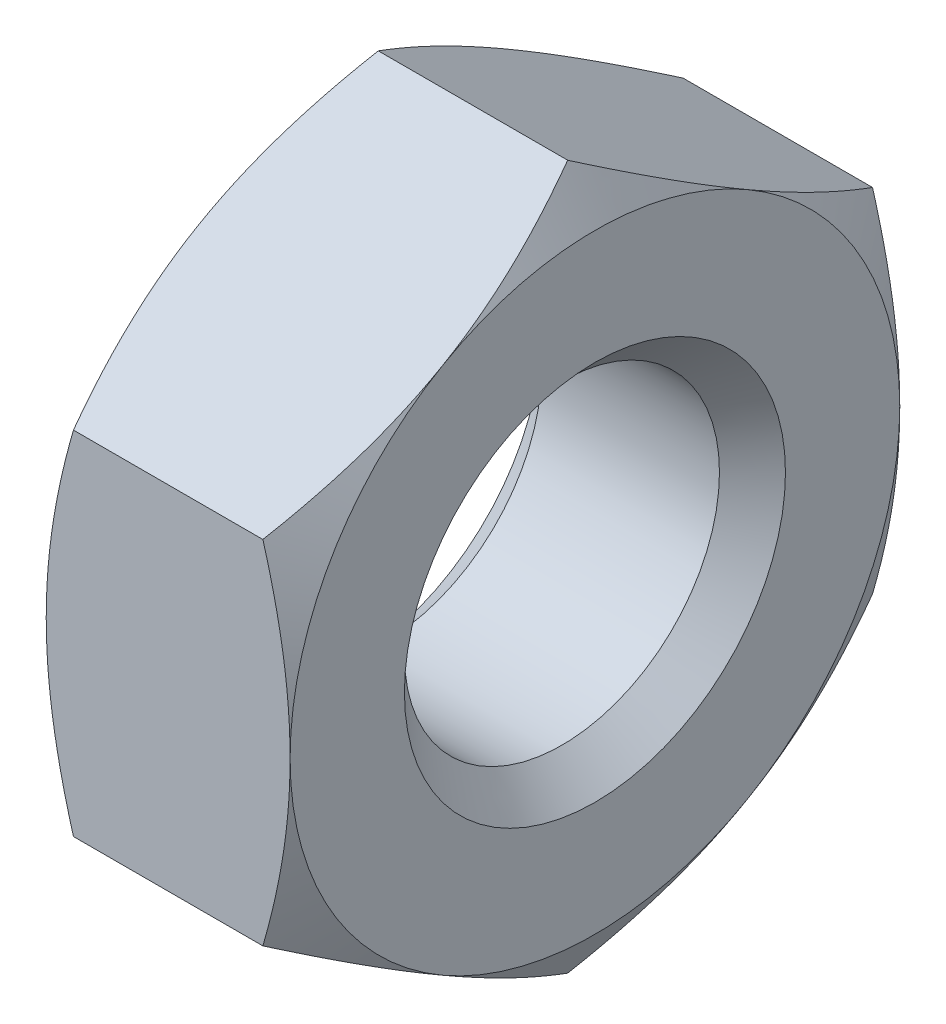
ISO-10303-21;
HEADER;
FILE_DESCRIPTION(('STEP AP214'),'2;1');
FILE_NAME('part.step','',(''),(''),'','','');
FILE_SCHEMA(('AUTOMOTIVE_DESIGN { 1 0 10303 214 1 1 1 1 }'));
ENDSEC;
DATA;
#1=APPLICATION_CONTEXT('core data for automotive mechanical design processes');
#2=APPLICATION_PROTOCOL_DEFINITION('international standard','automotive_design',2000,#1);
#3=PRODUCT_CONTEXT('',#1,'mechanical');
#4=PRODUCT('Part','Part','',(#3));
#5=PRODUCT_RELATED_PRODUCT_CATEGORY('part','',(#4));
#6=PRODUCT_DEFINITION_FORMATION('','',#4);
#7=PRODUCT_DEFINITION_CONTEXT('part definition',#1,'design');
#8=PRODUCT_DEFINITION('design','',#6,#7);
#9=PRODUCT_DEFINITION_SHAPE('','',#8);
#10=(LENGTH_UNIT() NAMED_UNIT(*) SI_UNIT(.MILLI.,.METRE.));
#11=(NAMED_UNIT(*) PLANE_ANGLE_UNIT() SI_UNIT($,.RADIAN.));
#12=(NAMED_UNIT(*) SI_UNIT($,.STERADIAN.) SOLID_ANGLE_UNIT());
#13=UNCERTAINTY_MEASURE_WITH_UNIT(LENGTH_MEASURE(1.E-05),#10,'distance_accuracy_value','');
#14=(GEOMETRIC_REPRESENTATION_CONTEXT(3) GLOBAL_UNCERTAINTY_ASSIGNED_CONTEXT((#13)) GLOBAL_UNIT_ASSIGNED_CONTEXT((#10,
#11,#12)) REPRESENTATION_CONTEXT('',''));
#15=CARTESIAN_POINT('',(0.,0.,0.));
#16=DIRECTION('',(0.,0.,1.));
#17=DIRECTION('',(1.,0.,0.));
#18=AXIS2_PLACEMENT_3D('',#15,#16,#17);
#19=CARTESIAN_POINT('',(-1.6,0.,0.));
#20=DIRECTION('',(1.,0.,0.));
#21=DIRECTION('',(0.,0.,-1.));
#22=AXIS2_PLACEMENT_3D('',#19,#20,#21);
#23=PLANE('',#22);
#24=CARTESIAN_POINT('',(-1.6,0.,0.));
#25=DIRECTION('',(-1.,0.,0.));
#26=DIRECTION('',(0.,0.,1.));
#27=AXIS2_PLACEMENT_3D('',#24,#25,#26);
#28=CIRCLE('',#27,4.);
#29=CARTESIAN_POINT('',(-1.6,0.,4.));
#30=VERTEX_POINT('',#29);
#31=CARTESIAN_POINT('',(-1.6,3.46410161513776,2.));
#32=VERTEX_POINT('',#31);
#33=EDGE_CURVE('E11',#30,#32,#28,.T.);
#34=ORIENTED_EDGE('',*,*,#33,.T.);
#35=CARTESIAN_POINT('',(-1.6,3.46410161513775,-2.));
#36=VERTEX_POINT('',#35);
#37=EDGE_CURVE('E43',#32,#36,#28,.T.);
#38=ORIENTED_EDGE('',*,*,#37,.T.);
#39=CARTESIAN_POINT('',(-1.6,0.,-4.));
#40=VERTEX_POINT('',#39);
#41=EDGE_CURVE('E339',#36,#40,#28,.T.);
#42=ORIENTED_EDGE('',*,*,#41,.T.);
#43=CARTESIAN_POINT('',(-1.6,-3.46410161513776,-2.));
#44=VERTEX_POINT('',#43);
#45=EDGE_CURVE('E337',#40,#44,#28,.T.);
#46=ORIENTED_EDGE('',*,*,#45,.T.);
#47=CARTESIAN_POINT('',(-1.6,-3.46410161513775,2.));
#48=VERTEX_POINT('',#47);
#49=EDGE_CURVE('E332',#44,#48,#28,.T.);
#50=ORIENTED_EDGE('',*,*,#49,.T.);
#51=EDGE_CURVE('E44',#48,#30,#28,.T.);
#52=ORIENTED_EDGE('',*,*,#51,.T.);
#53=EDGE_LOOP('',(#34,#38,#42,#46,#50,#52));
#54=FACE_BOUND('',#53,.T.);
#55=CARTESIAN_POINT('',(-1.6,0.,0.));
#56=DIRECTION('',(-1.,0.,0.));
#57=DIRECTION('',(0.,0.,1.));
#58=AXIS2_PLACEMENT_3D('',#55,#56,#57);
#59=CIRCLE('',#58,2.5);
#60=CARTESIAN_POINT('',(-1.6,0.,2.5));
#61=VERTEX_POINT('',#60);
#62=EDGE_CURVE('E141',#61,#61,#59,.T.);
#63=ORIENTED_EDGE('',*,*,#62,.F.);
#64=EDGE_LOOP('',(#63));
#65=FACE_BOUND('',#64,.T.);
#66=ADVANCED_FACE('F36',(#54,#65),#23,.F.);
#67=CARTESIAN_POINT('',(1.6,4.,0.));
#68=DIRECTION('',(-1.,0.,0.));
#69=DIRECTION('',(0.,0.,1.));
#70=AXIS2_PLACEMENT_3D('',#67,#68,#69);
#71=PLANE('',#70);
#72=CARTESIAN_POINT('',(1.6,0.,0.));
#73=DIRECTION('',(-1.,0.,0.));
#74=DIRECTION('',(0.,0.,1.));
#75=AXIS2_PLACEMENT_3D('',#72,#73,#74);
#76=CIRCLE('',#75,4.);
#77=CARTESIAN_POINT('',(1.6,0.,4.));
#78=VERTEX_POINT('',#77);
#79=CARTESIAN_POINT('',(1.6,3.46410161513776,2.));
#80=VERTEX_POINT('',#79);
#81=EDGE_CURVE('E288',#78,#80,#76,.T.);
#82=ORIENTED_EDGE('',*,*,#81,.F.);
#83=CARTESIAN_POINT('',(1.6,-3.46410161513776,2.));
#84=VERTEX_POINT('',#83);
#85=EDGE_CURVE('E278',#84,#78,#76,.T.);
#86=ORIENTED_EDGE('',*,*,#85,.F.);
#87=CARTESIAN_POINT('',(1.6,-3.46410161513776,-2.));
#88=VERTEX_POINT('',#87);
#89=EDGE_CURVE('E284',#88,#84,#76,.T.);
#90=ORIENTED_EDGE('',*,*,#89,.F.);
#91=CARTESIAN_POINT('',(1.6,0.,-4.));
#92=VERTEX_POINT('',#91);
#93=EDGE_CURVE('E290',#92,#88,#76,.T.);
#94=ORIENTED_EDGE('',*,*,#93,.F.);
#95=CARTESIAN_POINT('',(1.6,3.46410161513775,-2.));
#96=VERTEX_POINT('',#95);
#97=EDGE_CURVE('E291',#96,#92,#76,.T.);
#98=ORIENTED_EDGE('',*,*,#97,.F.);
#99=EDGE_CURVE('E292',#80,#96,#76,.T.);
#100=ORIENTED_EDGE('',*,*,#99,.F.);
#101=EDGE_LOOP('',(#82,#86,#90,#94,#98,#100));
#102=FACE_BOUND('',#101,.T.);
#103=CARTESIAN_POINT('',(1.6,0.,0.));
#104=DIRECTION('',(-1.,0.,0.));
#105=DIRECTION('',(0.,0.,1.));
#106=AXIS2_PLACEMENT_3D('',#103,#104,#105);
#107=CIRCLE('',#106,2.5);
#108=CARTESIAN_POINT('',(1.6,0.,2.5));
#109=VERTEX_POINT('',#108);
#110=EDGE_CURVE('E620',#109,#109,#107,.T.);
#111=ORIENTED_EDGE('',*,*,#110,.T.);
#112=EDGE_LOOP('',(#111));
#113=FACE_BOUND('',#112,.T.);
#114=ADVANCED_FACE('F172',(#102,#113),#71,.F.);
#115=CARTESIAN_POINT('',(-1.1381197846483,0.,0.));
#116=DIRECTION('',(1.,0.,0.));
#117=DIRECTION('',(0.,0.,-1.));
#118=AXIS2_PLACEMENT_3D('',#115,#116,#117);
#119=CONICAL_SURFACE('',#118,4.8,1.0471975511966);
#120=CARTESIAN_POINT('',(0.321129241439828,-6.13939413294062,-4.));
#121=CARTESIAN_POINT('',(0.236895438647627,-5.96521405575991,-4.));
#122=CARTESIAN_POINT('',(0.153488032778512,-5.79062719131365,-4.));
#123=CARTESIAN_POINT('',(-0.0112078629676559,-5.4404233088383,-4.));
#124=CARTESIAN_POINT('',(-0.092496005662846,-5.26480612772211,-4.));
#125=CARTESIAN_POINT('',(-0.252910016479831,-4.91138909620253,-4.));
#126=CARTESIAN_POINT('',(-0.332021126482258,-4.73358252336361,-4.));
#127=CARTESIAN_POINT('',(-0.486919193384971,-4.37653257309947,-4.));
#128=CARTESIAN_POINT('',(-0.562706311846289,-4.19728926600801,-4.));
#129=CARTESIAN_POINT('',(-0.712340691228334,-3.83154690304012,-4.));
#130=CARTESIAN_POINT('',(-0.786057043950778,-3.64499398861433,-4.));
#131=CARTESIAN_POINT('',(-0.927754117835969,-3.26968207246464,-4.));
#132=CARTESIAN_POINT('',(-0.995734186447363,-3.08092282252454,-4.));
#133=CARTESIAN_POINT('',(-1.12412704969832,-2.70127250879012,-4.));
#134=CARTESIAN_POINT('',(-1.18455573470301,-2.51038687463865,-4.));
#135=CARTESIAN_POINT('',(-1.29586469424675,-2.12587868357917,-4.));
#136=CARTESIAN_POINT('',(-1.34674804503767,-1.9322570301368,-4.));
#137=CARTESIAN_POINT('',(-1.43621571413744,-1.54322946382705,-4.));
#138=CARTESIAN_POINT('',(-1.47486428853927,-1.34783861004955,-4.));
#139=CARTESIAN_POINT('',(-1.53763422340833,-0.954695670395885,-4.));
#140=CARTESIAN_POINT('',(-1.56175683200502,-0.756943788878231,-4.));
#141=CARTESIAN_POINT('',(-1.59323359916261,-0.362621629692277,-4.));
#142=CARTESIAN_POINT('',(-1.60079822453623,-0.166068575033682,-4.));
#143=CARTESIAN_POINT('',(-1.59906790973023,0.226977102826042,-4.));
#144=CARTESIAN_POINT('',(-1.58977250832793,0.423469724226888,-4.));
#145=CARTESIAN_POINT('',(-1.5601531531514,0.758990273736848,-4.));
#146=CARTESIAN_POINT('',(-1.5437429725596,0.89838321105386,-4.));
#147=CARTESIAN_POINT('',(-1.50349476320339,1.176100092079,-4.));
#148=CARTESIAN_POINT('',(-1.47965566898105,1.31442387953113,-4.));
#149=CARTESIAN_POINT('',(-1.39825326079294,1.72763495504875,-4.));
#150=CARTESIAN_POINT('',(-1.33082125051095,2.00059716271885,-4.));
#151=CARTESIAN_POINT('',(-1.21451374843233,2.40866187771308,-4.));
#152=CARTESIAN_POINT('',(-1.17269287237421,2.54589494973042,-4.));
#153=CARTESIAN_POINT('',(-1.08486276665558,2.8190270799784,-4.));
#154=CARTESIAN_POINT('',(-1.03885351028714,2.95492612969629,-4.));
#155=CARTESIAN_POINT('',(-0.943372017914805,3.22543632873519,-4.));
#156=CARTESIAN_POINT('',(-0.893901026218928,3.36004792125235,-4.));
#157=CARTESIAN_POINT('',(-0.792062237734925,3.62816633823095,-4.));
#158=CARTESIAN_POINT('',(-0.739694467723296,3.76167317289116,-4.));
#159=CARTESIAN_POINT('',(-0.61762334906242,4.06475987665192,-4.));
#160=CARTESIAN_POINT('',(-0.547153932986005,4.23403057744385,-4.));
#161=CARTESIAN_POINT('',(-0.403059118637126,4.57122630399104,-4.));
#162=CARTESIAN_POINT('',(-0.329433568097402,4.73915126435628,-4.));
#163=CARTESIAN_POINT('',(-0.104752882922826,5.24128493973558,-4.));
#164=CARTESIAN_POINT('',(0.0500845152016255,5.57379958004733,-4.));
#165=CARTESIAN_POINT('',(0.366582884054273,6.23589456855969,-4.));
#166=CARTESIAN_POINT('',(0.528249781173928,6.56547205474271,-4.));
#167=CARTESIAN_POINT('',(0.856257013164823,7.22230103495155,-4.));
#168=CARTESIAN_POINT('',(1.02259750271072,7.54955245154487,-4.));
#169=CARTESIAN_POINT('',(1.3455353085463,8.17689265348598,-4.));
#170=CARTESIAN_POINT('',(1.50188182726285,8.47711096920769,-4.));
#171=CARTESIAN_POINT('',(1.81673779002285,9.0764211853834,-4.));
#172=CARTESIAN_POINT('',(1.97524729703226,9.37551305272098,-4.));
#173=CARTESIAN_POINT('',(2.29357719735176,9.97215228024381,-4.));
#174=CARTESIAN_POINT('',(2.4533939408404,10.2697015905905,-4.));
#175=CARTESIAN_POINT('',(2.77434114680156,10.8640723738864,-4.));
#176=CARTESIAN_POINT('',(2.93547154464302,11.1608938817197,-4.));
#177=CARTESIAN_POINT('',(3.09709645417554,11.4574439973737,-4.));
#178=B_SPLINE_CURVE_WITH_KNOTS('',3,(#120,#121,#122,#123,#124,#125,#126,#127,#128,#129,#130,
#131,#132,#133,#134,#135,#136,#137,#138,#139,#140,#141,#142,#143,#144,#145,#146,#147,#148,#149,
#150,#151,#152,#153,#154,#155,#156,#157,#158,#159,#160,#161,#162,#163,#164,#165,#166,#167,#168,
#169,#170,#171,#172,#173,#174,#175,#176,#177),.UNSPECIFIED.,.F.,.F.,(4,2,2,2,2,2,2,2,2,2,2,2,2,
2,2,2,2,2,2,2,2,2,2,2,2,2,2,2,4),(0.,0.580443710282804,1.16098191997214,1.74479005581555,
2.32856978442475,2.93026499507169,3.5320285616732,4.13250371575107,4.73278501614092,
5.32985927078347,5.92688221507966,6.51627129067316,7.10567648982993,7.52653774537938,
7.94745938882889,8.78979727003887,9.22015473586379,9.65051494613078,10.0807212518396,
10.5109235815821,11.0609419553601,11.610986894627,12.7112482185919,13.8124847525737,
14.9137577755076,15.9292165443316,16.9447049371325,17.957959920125,18.9711653488122),.UNSPECIFIED.);
#179=CARTESIAN_POINT('',(-1.24273441009184,-2.3094010767585,-4.));
#180=VERTEX_POINT('',#179);
#181=EDGE_CURVE('E348',#180,#40,#178,.T.);
#182=ORIENTED_EDGE('',*,*,#181,.F.);
#183=CARTESIAN_POINT('',(-1.24266774092523,-4.61891762357084,0.00020000000000006));
#184=CARTESIAN_POINT('',(-1.30128212635172,-4.51743148381381,-0.175579150323228));
#185=CARTESIAN_POINT('',(-1.35458967853774,-4.41506932144052,-0.352875616326381));
#186=CARTESIAN_POINT('',(-1.4476383292536,-4.20857250547739,-0.710538593175707));
#187=CARTESIAN_POINT('',(-1.4873465109703,-4.10443418285647,-0.890911458970152));
#188=CARTESIAN_POINT('',(-1.54915778471972,-3.89744813015756,-1.24942181870279));
#189=CARTESIAN_POINT('',(-1.57167226847711,-3.79463224655059,-1.42750415293514));
#190=CARTESIAN_POINT('',(-1.59854937685342,-3.58851671999023,-1.78450671716651));
#191=CARTESIAN_POINT('',(-1.60293425857306,-3.48521782616117,-1.9634256496441));
#192=CARTESIAN_POINT('',(-1.59380992706003,-3.29219970504619,-2.29774284219673));
#193=CARTESIAN_POINT('',(-1.58254104601201,-3.20245157692486,-2.45319115998707));
#194=CARTESIAN_POINT('',(-1.54682600920181,-3.02354002635497,-2.76307505563506));
#195=CARTESIAN_POINT('',(-1.52236765428847,-2.93437722268073,-2.91750956174413));
#196=CARTESIAN_POINT('',(-1.46122393508071,-2.75509682012354,-3.22803232777458));
#197=CARTESIAN_POINT('',(-1.42427939634514,-2.6650019108942,-3.3840812880631));
#198=CARTESIAN_POINT('',(-1.34042992745197,-2.48615580200001,-3.69385183540384));
#199=CARTESIAN_POINT('',(-1.29354469778726,-2.39740231122585,-3.84757739077378));
#200=CARTESIAN_POINT('',(-1.24266774092523,-2.30928560670467,-4.0002));
#201=B_SPLINE_CURVE_WITH_KNOTS('',3,(#183,#184,#185,#186,#187,#188,#189,#190,#191,#192,#193,
#194,#195,#196,#197,#198,#199,#200),.UNSPECIFIED.,.F.,.F.,(4,2,2,2,2,2,2,2,4),(0.,
0.634047835695967,1.26961969224544,1.88946157213122,2.50854226669297,3.04757825393386,
3.58711366126903,4.13861653143764,4.68903648037743),.UNSPECIFIED.);
#202=EDGE_CURVE('E190',#44,#180,#201,.T.);
#203=ORIENTED_EDGE('',*,*,#202,.F.);
#204=ORIENTED_EDGE('',*,*,#45,.F.);
#205=EDGE_LOOP('',(#182,#203,#204));
#206=FACE_BOUND('',#205,.T.);
#207=ADVANCED_FACE('F168',(#206),#119,.T.);
#208=CARTESIAN_POINT('',(-1.24273441009184,2.3094010767585,-4.));
#209=VERTEX_POINT('',#208);
#210=EDGE_CURVE('E198',#40,#209,#178,.T.);
#211=ORIENTED_EDGE('',*,*,#210,.F.);
#212=ORIENTED_EDGE('',*,*,#41,.F.);
#213=CARTESIAN_POINT('',(-1.24266774092523,2.30928560670467,-4.0002));
#214=CARTESIAN_POINT('',(-1.30128212635172,2.41077174646171,-3.82442084967677));
#215=CARTESIAN_POINT('',(-1.35458967853774,2.513133908835,-3.64712438367362));
#216=CARTESIAN_POINT('',(-1.4476383292536,2.71963072479812,-3.28946140682429));
#217=CARTESIAN_POINT('',(-1.4873465109703,2.82376904741904,-3.10908854102985));
#218=CARTESIAN_POINT('',(-1.54915778471972,3.03075510011795,-2.75057818129721));
#219=CARTESIAN_POINT('',(-1.57167226847711,3.13357098372492,-2.57249584706486));
#220=CARTESIAN_POINT('',(-1.59854937685342,3.33968651028528,-2.21549328283349));
#221=CARTESIAN_POINT('',(-1.60293425857306,3.44298540411434,-2.0365743503559));
#222=CARTESIAN_POINT('',(-1.59380992706003,3.63600352522932,-1.70225715780327));
#223=CARTESIAN_POINT('',(-1.58254104601201,3.72575165335065,-1.54680884001293));
#224=CARTESIAN_POINT('',(-1.54682600920181,3.90466320392054,-1.23692494436494));
#225=CARTESIAN_POINT('',(-1.52236765428847,3.99382600759478,-1.08249043825587));
#226=CARTESIAN_POINT('',(-1.46122393508071,4.17310641015197,-0.771967672225421));
#227=CARTESIAN_POINT('',(-1.42427939634514,4.26320131938131,-0.615918711936897));
#228=CARTESIAN_POINT('',(-1.34042992745197,4.4420474282755,-0.30614816459616));
#229=CARTESIAN_POINT('',(-1.29354469778726,4.53080091904966,-0.15242260922622));
#230=CARTESIAN_POINT('',(-1.24266774092523,4.61891762357084,0.000199999999999782));
#231=B_SPLINE_CURVE_WITH_KNOTS('',3,(#213,#214,#215,#216,#217,#218,#219,#220,#221,#222,#223,
#224,#225,#226,#227,#228,#229,#230),.UNSPECIFIED.,.F.,.F.,(4,2,2,2,2,2,2,2,4),(0.,
0.634047835695967,1.26961969224544,1.88946157213122,2.50854226669297,3.04757825393386,
3.58711366126904,4.13861653143764,4.68903648037743),.UNSPECIFIED.);
#232=EDGE_CURVE('E213',#209,#36,#231,.T.);
#233=ORIENTED_EDGE('',*,*,#232,.F.);
#234=EDGE_LOOP('',(#211,#212,#233));
#235=FACE_BOUND('',#234,.T.);
#236=ADVANCED_FACE('F171',(#235),#119,.T.);
#237=CARTESIAN_POINT('',(-1.24273441009184,4.61880215351701,0.));
#238=VERTEX_POINT('',#237);
#239=EDGE_CURVE('E206',#36,#238,#231,.T.);
#240=ORIENTED_EDGE('',*,*,#239,.F.);
#241=ORIENTED_EDGE('',*,*,#37,.F.);
#242=CARTESIAN_POINT('',(-1.24266774092523,4.61891762357084,-0.00020000000000006));
#243=CARTESIAN_POINT('',(-1.30128212635172,4.51743148381381,0.175579150323228));
#244=CARTESIAN_POINT('',(-1.35458967853774,4.41506932144052,0.352875616326381));
#245=CARTESIAN_POINT('',(-1.4476383292536,4.20857250547739,0.710538593175707));
#246=CARTESIAN_POINT('',(-1.4873465109703,4.10443418285647,0.890911458970152));
#247=CARTESIAN_POINT('',(-1.54915778471972,3.89744813015756,1.24942181870279));
#248=CARTESIAN_POINT('',(-1.57167226847711,3.79463224655059,1.42750415293514));
#249=CARTESIAN_POINT('',(-1.59854937685342,3.58851671999023,1.78450671716651));
#250=CARTESIAN_POINT('',(-1.60293425857306,3.48521782616117,1.9634256496441));
#251=CARTESIAN_POINT('',(-1.59380992706003,3.29219970504619,2.29774284219673));
#252=CARTESIAN_POINT('',(-1.58254104601201,3.20245157692486,2.45319115998707));
#253=CARTESIAN_POINT('',(-1.54682600920181,3.02354002635497,2.76307505563506));
#254=CARTESIAN_POINT('',(-1.52236765428847,2.93437722268073,2.91750956174413));
#255=CARTESIAN_POINT('',(-1.46122393508071,2.75509682012354,3.22803232777458));
#256=CARTESIAN_POINT('',(-1.42427939634514,2.6650019108942,3.3840812880631));
#257=CARTESIAN_POINT('',(-1.34042992745197,2.48615580200001,3.69385183540384));
#258=CARTESIAN_POINT('',(-1.29354469778726,2.39740231122585,3.84757739077378));
#259=CARTESIAN_POINT('',(-1.24266774092523,2.30928560670467,4.0002));
#260=B_SPLINE_CURVE_WITH_KNOTS('',3,(#242,#243,#244,#245,#246,#247,#248,#249,#250,#251,#252,
#253,#254,#255,#256,#257,#258,#259),.UNSPECIFIED.,.F.,.F.,(4,2,2,2,2,2,2,2,4),(0.,
0.634047835695967,1.26961969224544,1.88946157213122,2.50854226669297,3.04757825393386,
3.58711366126903,4.13861653143764,4.68903648037743),.UNSPECIFIED.);
#261=EDGE_CURVE('E132',#238,#32,#260,.T.);
#262=ORIENTED_EDGE('',*,*,#261,.F.);
#263=EDGE_LOOP('',(#240,#241,#262));
#264=FACE_BOUND('',#263,.T.);
#265=ADVANCED_FACE('F343',(#264),#119,.T.);
#266=CARTESIAN_POINT('',(-1.24273441009184,-4.61880215351701,0.));
#267=VERTEX_POINT('',#266);
#268=EDGE_CURVE('E246',#267,#44,#201,.T.);
#269=ORIENTED_EDGE('',*,*,#268,.F.);
#270=CARTESIAN_POINT('',(-1.24266774092523,-2.30928560670467,4.0002));
#271=CARTESIAN_POINT('',(-1.30128212635172,-2.41077174646171,3.82442084967677));
#272=CARTESIAN_POINT('',(-1.35458967853774,-2.513133908835,3.64712438367362));
#273=CARTESIAN_POINT('',(-1.4476383292536,-2.71963072479812,3.28946140682429));
#274=CARTESIAN_POINT('',(-1.4873465109703,-2.82376904741904,3.10908854102985));
#275=CARTESIAN_POINT('',(-1.54915778471972,-3.03075510011795,2.75057818129721));
#276=CARTESIAN_POINT('',(-1.57167226847711,-3.13357098372492,2.57249584706486));
#277=CARTESIAN_POINT('',(-1.59854937685342,-3.33968651028528,2.21549328283349));
#278=CARTESIAN_POINT('',(-1.60293425857306,-3.44298540411434,2.0365743503559));
#279=CARTESIAN_POINT('',(-1.59380992706003,-3.63600352522932,1.70225715780327));
#280=CARTESIAN_POINT('',(-1.58254104601201,-3.72575165335065,1.54680884001293));
#281=CARTESIAN_POINT('',(-1.54682600920181,-3.90466320392054,1.23692494436494));
#282=CARTESIAN_POINT('',(-1.52236765428847,-3.99382600759478,1.08249043825587));
#283=CARTESIAN_POINT('',(-1.46122393508071,-4.17310641015197,0.771967672225421));
#284=CARTESIAN_POINT('',(-1.42427939634514,-4.26320131938131,0.615918711936897));
#285=CARTESIAN_POINT('',(-1.34042992745197,-4.4420474282755,0.30614816459616));
#286=CARTESIAN_POINT('',(-1.29354469778726,-4.53080091904966,0.15242260922622));
#287=CARTESIAN_POINT('',(-1.24266774092523,-4.61891762357084,-0.000199999999999782));
#288=B_SPLINE_CURVE_WITH_KNOTS('',3,(#270,#271,#272,#273,#274,#275,#276,#277,#278,#279,#280,
#281,#282,#283,#284,#285,#286,#287),.UNSPECIFIED.,.F.,.F.,(4,2,2,2,2,2,2,2,4),(0.,
0.634047835695967,1.26961969224544,1.88946157213122,2.50854226669297,3.04757825393386,
3.58711366126904,4.13861653143764,4.68903648037743),.UNSPECIFIED.);
#289=EDGE_CURVE('E182',#48,#267,#288,.T.);
#290=ORIENTED_EDGE('',*,*,#289,.F.);
#291=ORIENTED_EDGE('',*,*,#49,.F.);
#292=EDGE_LOOP('',(#269,#290,#291));
#293=FACE_BOUND('',#292,.T.);
#294=ADVANCED_FACE('F447',(#293),#119,.T.);
#295=CARTESIAN_POINT('',(-1.24273441009184,2.3094010767585,4.));
#296=VERTEX_POINT('',#295);
#297=EDGE_CURVE('E126',#32,#296,#260,.T.);
#298=ORIENTED_EDGE('',*,*,#297,.F.);
#299=ORIENTED_EDGE('',*,*,#33,.F.);
#300=CARTESIAN_POINT('',(0.321129241439828,-6.13939413294062,4.));
#301=CARTESIAN_POINT('',(0.236895438647627,-5.96521405575991,4.));
#302=CARTESIAN_POINT('',(0.153488032778512,-5.79062719131365,4.));
#303=CARTESIAN_POINT('',(-0.0112078629676559,-5.4404233088383,4.));
#304=CARTESIAN_POINT('',(-0.092496005662846,-5.26480612772211,4.));
#305=CARTESIAN_POINT('',(-0.252910016479831,-4.91138909620253,4.));
#306=CARTESIAN_POINT('',(-0.332021126482258,-4.73358252336361,4.));
#307=CARTESIAN_POINT('',(-0.486919193384971,-4.37653257309947,4.));
#308=CARTESIAN_POINT('',(-0.562706311846289,-4.19728926600801,4.));
#309=CARTESIAN_POINT('',(-0.712340691228334,-3.83154690304012,4.));
#310=CARTESIAN_POINT('',(-0.786057043950778,-3.64499398861433,4.));
#311=CARTESIAN_POINT('',(-0.927754117835969,-3.26968207246464,4.));
#312=CARTESIAN_POINT('',(-0.995734186447363,-3.08092282252454,4.));
#313=CARTESIAN_POINT('',(-1.12412704969832,-2.70127250879012,4.));
#314=CARTESIAN_POINT('',(-1.18455573470301,-2.51038687463865,4.));
#315=CARTESIAN_POINT('',(-1.29586469424675,-2.12587868357917,4.));
#316=CARTESIAN_POINT('',(-1.34674804503767,-1.9322570301368,4.));
#317=CARTESIAN_POINT('',(-1.43621571413744,-1.54322946382705,4.));
#318=CARTESIAN_POINT('',(-1.47486428853927,-1.34783861004955,4.));
#319=CARTESIAN_POINT('',(-1.53763422340833,-0.954695670395885,4.));
#320=CARTESIAN_POINT('',(-1.56175683200502,-0.756943788878231,4.));
#321=CARTESIAN_POINT('',(-1.59323359916261,-0.362621629692277,4.));
#322=CARTESIAN_POINT('',(-1.60079822453623,-0.166068575033682,4.));
#323=CARTESIAN_POINT('',(-1.59906790973023,0.226977102826042,4.));
#324=CARTESIAN_POINT('',(-1.58977250832793,0.423469724226888,4.));
#325=CARTESIAN_POINT('',(-1.5601531531514,0.758990273736848,4.));
#326=CARTESIAN_POINT('',(-1.5437429725596,0.89838321105386,4.));
#327=CARTESIAN_POINT('',(-1.50349476320339,1.176100092079,4.));
#328=CARTESIAN_POINT('',(-1.47965566898105,1.31442387953113,4.));
#329=CARTESIAN_POINT('',(-1.39825326079294,1.72763495504875,4.));
#330=CARTESIAN_POINT('',(-1.33082125051095,2.00059716271885,4.));
#331=CARTESIAN_POINT('',(-1.21451374843233,2.40866187771308,4.));
#332=CARTESIAN_POINT('',(-1.17269287237421,2.54589494973042,4.));
#333=CARTESIAN_POINT('',(-1.08486276665558,2.8190270799784,4.));
#334=CARTESIAN_POINT('',(-1.03885351028714,2.95492612969629,4.));
#335=CARTESIAN_POINT('',(-0.943372017914805,3.22543632873519,4.));
#336=CARTESIAN_POINT('',(-0.893901026218928,3.36004792125235,4.));
#337=CARTESIAN_POINT('',(-0.792062237734925,3.62816633823095,4.));
#338=CARTESIAN_POINT('',(-0.739694467723296,3.76167317289116,4.));
#339=CARTESIAN_POINT('',(-0.61762334906242,4.06475987665192,4.));
#340=CARTESIAN_POINT('',(-0.547153932986005,4.23403057744385,4.));
#341=CARTESIAN_POINT('',(-0.403059118637126,4.57122630399104,4.));
#342=CARTESIAN_POINT('',(-0.329433568097402,4.73915126435628,4.));
#343=CARTESIAN_POINT('',(-0.104752882922826,5.24128493973558,4.));
#344=CARTESIAN_POINT('',(0.0500845152016255,5.57379958004733,4.));
#345=CARTESIAN_POINT('',(0.366582884054273,6.23589456855969,4.));
#346=CARTESIAN_POINT('',(0.528249781173928,6.56547205474271,4.));
#347=CARTESIAN_POINT('',(0.856257013164823,7.22230103495155,4.));
#348=CARTESIAN_POINT('',(1.02259750271072,7.54955245154487,4.));
#349=CARTESIAN_POINT('',(1.3455353085463,8.17689265348598,4.));
#350=CARTESIAN_POINT('',(1.50188182726285,8.47711096920769,4.));
#351=CARTESIAN_POINT('',(1.81673779002285,9.0764211853834,4.));
#352=CARTESIAN_POINT('',(1.97524729703226,9.37551305272098,4.));
#353=CARTESIAN_POINT('',(2.29357719735176,9.97215228024381,4.));
#354=CARTESIAN_POINT('',(2.4533939408404,10.2697015905905,4.));
#355=CARTESIAN_POINT('',(2.77434114680156,10.8640723738864,4.));
#356=CARTESIAN_POINT('',(2.93547154464302,11.1608938817197,4.));
#357=CARTESIAN_POINT('',(3.09709645417554,11.4574439973737,4.));
#358=B_SPLINE_CURVE_WITH_KNOTS('',3,(#300,#301,#302,#303,#304,#305,#306,#307,#308,#309,#310,
#311,#312,#313,#314,#315,#316,#317,#318,#319,#320,#321,#322,#323,#324,#325,#326,#327,#328,#329,
#330,#331,#332,#333,#334,#335,#336,#337,#338,#339,#340,#341,#342,#343,#344,#345,#346,#347,#348,
#349,#350,#351,#352,#353,#354,#355,#356,#357),.UNSPECIFIED.,.F.,.F.,(4,2,2,2,2,2,2,2,2,2,2,2,2,
2,2,2,2,2,2,2,2,2,2,2,2,2,2,2,4),(0.,0.580443710282804,1.16098191997214,1.74479005581555,
2.32856978442475,2.93026499507169,3.5320285616732,4.13250371575107,4.73278501614092,
5.32985927078347,5.92688221507966,6.51627129067316,7.10567648982993,7.52653774537938,
7.94745938882889,8.78979727003887,9.22015473586379,9.65051494613078,10.0807212518396,
10.5109235815821,11.0609419553601,11.610986894627,12.7112482185919,13.8124847525737,
14.9137577755076,15.9292165443316,16.9447049371325,17.957959920125,18.9711653488122),.UNSPECIFIED.);
#359=EDGE_CURVE('E51',#296,#30,#358,.F.);
#360=ORIENTED_EDGE('',*,*,#359,.F.);
#361=EDGE_LOOP('',(#298,#299,#360));
#362=FACE_BOUND('',#361,.T.);
#363=ADVANCED_FACE('F143',(#362),#119,.T.);
#364=CARTESIAN_POINT('',(-1.24273441009184,-2.3094010767585,4.));
#365=VERTEX_POINT('',#364);
#366=EDGE_CURVE('E258',#365,#48,#288,.T.);
#367=ORIENTED_EDGE('',*,*,#366,.F.);
#368=EDGE_CURVE('E145',#30,#365,#358,.F.);
#369=ORIENTED_EDGE('',*,*,#368,.F.);
#370=ORIENTED_EDGE('',*,*,#51,.F.);
#371=EDGE_LOOP('',(#367,#369,#370));
#372=FACE_BOUND('',#371,.T.);
#373=ADVANCED_FACE('F174',(#372),#119,.T.);
#374=CARTESIAN_POINT('',(-3.2,4.61880215351701,0.));
#375=DIRECTION('',(0.,0.866025403784439,0.5));
#376=DIRECTION('',(0.,-0.5,0.866025403784439));
#377=AXIS2_PLACEMENT_3D('',#374,#375,#376);
#378=PLANE('',#377);
#379=ORIENTED_EDGE('',*,*,#261,.T.);
#380=ORIENTED_EDGE('',*,*,#297,.T.);
#381=DIRECTION('',(1.,0.,0.));
#382=VECTOR('',#381,1.);
#383=CARTESIAN_POINT('',(-3.2,2.3094010767585,4.));
#384=LINE('',#383,#382);
#385=CARTESIAN_POINT('',(1.24273441009184,2.3094010767585,4.));
#386=VERTEX_POINT('',#385);
#387=EDGE_CURVE('E128',#296,#386,#384,.T.);
#388=ORIENTED_EDGE('',*,*,#387,.T.);
#389=CARTESIAN_POINT('',(1.24266774092523,2.30928560670467,4.0002));
#390=CARTESIAN_POINT('',(1.30128212635172,2.41077174646171,3.82442084967677));
#391=CARTESIAN_POINT('',(1.35458967853774,2.513133908835,3.64712438367362));
#392=CARTESIAN_POINT('',(1.4476383292536,2.71963072479812,3.28946140682429));
#393=CARTESIAN_POINT('',(1.4873465109703,2.82376904741904,3.10908854102985));
#394=CARTESIAN_POINT('',(1.54915778471972,3.03075510011795,2.75057818129721));
#395=CARTESIAN_POINT('',(1.57167226847711,3.13357098372492,2.57249584706486));
#396=CARTESIAN_POINT('',(1.59854937685342,3.33968651028528,2.21549328283349));
#397=CARTESIAN_POINT('',(1.60293425857306,3.44298540411434,2.0365743503559));
#398=CARTESIAN_POINT('',(1.59380992706003,3.63600352522932,1.70225715780327));
#399=CARTESIAN_POINT('',(1.58254104601201,3.72575165335065,1.54680884001293));
#400=CARTESIAN_POINT('',(1.54682600920181,3.90466320392054,1.23692494436494));
#401=CARTESIAN_POINT('',(1.52236765428847,3.99382600759478,1.08249043825587));
#402=CARTESIAN_POINT('',(1.46122393508071,4.17310641015197,0.771967672225421));
#403=CARTESIAN_POINT('',(1.42427939634514,4.26320131938131,0.615918711936897));
#404=CARTESIAN_POINT('',(1.34042992745197,4.4420474282755,0.30614816459616));
#405=CARTESIAN_POINT('',(1.29354469778726,4.53080091904966,0.15242260922622));
#406=CARTESIAN_POINT('',(1.24266774092523,4.61891762357084,-0.000199999999999846));
#407=B_SPLINE_CURVE_WITH_KNOTS('',3,(#389,#390,#391,#392,#393,#394,#395,#396,#397,#398,#399,
#400,#401,#402,#403,#404,#405,#406),.UNSPECIFIED.,.F.,.F.,(4,2,2,2,2,2,2,2,4),(0.,
0.634047835695967,1.26961969224543,1.88946157213122,2.50854226669297,3.04757825393386,
3.58711366126903,4.13861653143764,4.68903648037743),.UNSPECIFIED.);
#408=EDGE_CURVE('E136',#386,#80,#407,.T.);
#409=ORIENTED_EDGE('',*,*,#408,.T.);
#410=CARTESIAN_POINT('',(1.24273441009184,4.61880215351701,0.));
#411=VERTEX_POINT('',#410);
#412=EDGE_CURVE('E220',#80,#411,#407,.T.);
#413=ORIENTED_EDGE('',*,*,#412,.T.);
#414=DIRECTION('',(1.,0.,0.));
#415=VECTOR('',#414,1.);
#416=CARTESIAN_POINT('',(-3.2,4.61880215351701,0.));
#417=LINE('',#416,#415);
#418=EDGE_CURVE('E320',#238,#411,#417,.T.);
#419=ORIENTED_EDGE('',*,*,#418,.F.);
#420=EDGE_LOOP('',(#379,#380,#388,#409,#413,#419));
#421=FACE_BOUND('',#420,.T.);
#422=ADVANCED_FACE('F127',(#421),#378,.T.);
#423=CARTESIAN_POINT('',(-3.2,2.3094010767585,-4.));
#424=DIRECTION('',(0.,0.866025403784439,-0.5));
#425=DIRECTION('',(0.,0.5,0.866025403784439));
#426=AXIS2_PLACEMENT_3D('',#423,#424,#425);
#427=PLANE('',#426);
#428=ORIENTED_EDGE('',*,*,#232,.T.);
#429=ORIENTED_EDGE('',*,*,#239,.T.);
#430=ORIENTED_EDGE('',*,*,#418,.T.);
#431=CARTESIAN_POINT('',(1.24266774092523,4.61891762357084,0.0002));
#432=CARTESIAN_POINT('',(1.30128212635172,4.5174314838138,-0.175579150323228));
#433=CARTESIAN_POINT('',(1.35458967853774,4.41506932144052,-0.352875616326381));
#434=CARTESIAN_POINT('',(1.4476383292536,4.20857250547739,-0.710538593175707));
#435=CARTESIAN_POINT('',(1.4873465109703,4.10443418285647,-0.890911458970151));
#436=CARTESIAN_POINT('',(1.54915778471972,3.89744813015756,-1.24942181870279));
#437=CARTESIAN_POINT('',(1.57167226847711,3.79463224655059,-1.42750415293514));
#438=CARTESIAN_POINT('',(1.59854937685342,3.58851671999023,-1.78450671716651));
#439=CARTESIAN_POINT('',(1.60293425857306,3.48521782616117,-1.9634256496441));
#440=CARTESIAN_POINT('',(1.59380992706003,3.29219970504619,-2.29774284219673));
#441=CARTESIAN_POINT('',(1.58254104601201,3.20245157692486,-2.45319115998707));
#442=CARTESIAN_POINT('',(1.54682600920181,3.02354002635497,-2.76307505563506));
#443=CARTESIAN_POINT('',(1.52236765428847,2.93437722268073,-2.91750956174413));
#444=CARTESIAN_POINT('',(1.46122393508071,2.75509682012354,-3.22803232777458));
#445=CARTESIAN_POINT('',(1.42427939634514,2.6650019108942,-3.3840812880631));
#446=CARTESIAN_POINT('',(1.34042992745197,2.48615580200001,-3.69385183540384));
#447=CARTESIAN_POINT('',(1.29354469778726,2.39740231122585,-3.84757739077378));
#448=CARTESIAN_POINT('',(1.24266774092523,2.30928560670467,-4.0002));
#449=B_SPLINE_CURVE_WITH_KNOTS('',3,(#431,#432,#433,#434,#435,#436,#437,#438,#439,#440,#441,
#442,#443,#444,#445,#446,#447,#448),.UNSPECIFIED.,.F.,.F.,(4,2,2,2,2,2,2,2,4),(0.,
0.634047835695966,1.26961969224543,1.88946157213122,2.50854226669297,3.04757825393386,
3.58711366126903,4.13861653143764,4.68903648037743),.UNSPECIFIED.);
#450=EDGE_CURVE('E214',#411,#96,#449,.T.);
#451=ORIENTED_EDGE('',*,*,#450,.T.);
#452=CARTESIAN_POINT('',(1.24273441009184,2.3094010767585,-4.));
#453=VERTEX_POINT('',#452);
#454=EDGE_CURVE('E215',#96,#453,#449,.T.);
#455=ORIENTED_EDGE('',*,*,#454,.T.);
#456=DIRECTION('',(1.,0.,0.));
#457=VECTOR('',#456,1.);
#458=CARTESIAN_POINT('',(-3.2,2.3094010767585,-4.));
#459=LINE('',#458,#457);
#460=EDGE_CURVE('E323',#209,#453,#459,.T.);
#461=ORIENTED_EDGE('',*,*,#460,.F.);
#462=EDGE_LOOP('',(#428,#429,#430,#451,#455,#461));
#463=FACE_BOUND('',#462,.T.);
#464=ADVANCED_FACE('F225',(#463),#427,.T.);
#465=CARTESIAN_POINT('',(-3.2,-2.3094010767585,-4.));
#466=DIRECTION('',(0.,0.,-1.));
#467=DIRECTION('',(-1.,0.,0.));
#468=AXIS2_PLACEMENT_3D('',#465,#466,#467);
#469=PLANE('',#468);
#470=ORIENTED_EDGE('',*,*,#181,.T.);
#471=ORIENTED_EDGE('',*,*,#210,.T.);
#472=ORIENTED_EDGE('',*,*,#460,.T.);
#473=CARTESIAN_POINT('',(-0.321129241439824,-6.13939413294062,-4.));
#474=CARTESIAN_POINT('',(-0.236895438647623,-5.96521405575991,-4.));
#475=CARTESIAN_POINT('',(-0.153488032778508,-5.79062719131365,-4.));
#476=CARTESIAN_POINT('',(0.0112078629676588,-5.4404233088383,-4.));
#477=CARTESIAN_POINT('',(0.0924960056628487,-5.26480612772211,-4.));
#478=CARTESIAN_POINT('',(0.252910016479834,-4.91138909620254,-4.));
#479=CARTESIAN_POINT('',(0.33202112648226,-4.73358252336361,-4.));
#480=CARTESIAN_POINT('',(0.486919193384973,-4.37653257309947,-4.));
#481=CARTESIAN_POINT('',(0.56270631184629,-4.19728926600801,-4.));
#482=CARTESIAN_POINT('',(0.712340691228335,-3.83154690304012,-4.));
#483=CARTESIAN_POINT('',(0.786057043950779,-3.64499398861433,-4.));
#484=CARTESIAN_POINT('',(0.92775411783597,-3.26968207246464,-4.));
#485=CARTESIAN_POINT('',(0.995734186447364,-3.08092282252454,-4.));
#486=CARTESIAN_POINT('',(1.12412704969832,-2.70127250879012,-4.));
#487=CARTESIAN_POINT('',(1.18455573470301,-2.51038687463865,-4.));
#488=CARTESIAN_POINT('',(1.29586469424675,-2.12587868357917,-4.));
#489=CARTESIAN_POINT('',(1.34674804503767,-1.9322570301368,-4.));
#490=CARTESIAN_POINT('',(1.43621571413744,-1.54322946382705,-4.));
#491=CARTESIAN_POINT('',(1.47486428853927,-1.34783861004954,-4.));
#492=CARTESIAN_POINT('',(1.53763422340833,-0.954695670395885,-4.));
#493=CARTESIAN_POINT('',(1.56175683200502,-0.756943788878231,-4.));
#494=CARTESIAN_POINT('',(1.59323359916261,-0.362621629692277,-4.));
#495=CARTESIAN_POINT('',(1.60079822453623,-0.166068575033681,-4.));
#496=CARTESIAN_POINT('',(1.59906790973023,0.226977102826042,-4.));
#497=CARTESIAN_POINT('',(1.58977250832793,0.423469724226888,-4.));
#498=CARTESIAN_POINT('',(1.5601531531514,0.758990273736848,-4.));
#499=CARTESIAN_POINT('',(1.5437429725596,0.89838321105386,-4.));
#500=CARTESIAN_POINT('',(1.50349476320339,1.17610009207901,-4.));
#501=CARTESIAN_POINT('',(1.47965566898105,1.31442387953113,-4.));
#502=CARTESIAN_POINT('',(1.39825326079294,1.72763495504876,-4.));
#503=CARTESIAN_POINT('',(1.33082125051095,2.00059716271885,-4.));
#504=CARTESIAN_POINT('',(1.21451374843233,2.40866187771309,-4.));
#505=CARTESIAN_POINT('',(1.17269287237421,2.54589494973043,-4.));
#506=CARTESIAN_POINT('',(1.08486276665558,2.81902707997841,-4.));
#507=CARTESIAN_POINT('',(1.03885351028714,2.9549261296963,-4.));
#508=CARTESIAN_POINT('',(0.943372017914804,3.2254363287352,-4.));
#509=CARTESIAN_POINT('',(0.893901026218926,3.36004792125236,-4.));
#510=CARTESIAN_POINT('',(0.792062237734923,3.62816633823096,-4.));
#511=CARTESIAN_POINT('',(0.739694467723293,3.76167317289117,-4.));
#512=CARTESIAN_POINT('',(0.617623349062418,4.06475987665193,-4.));
#513=CARTESIAN_POINT('',(0.547153932986003,4.23403057744386,-4.));
#514=CARTESIAN_POINT('',(0.403059118637124,4.57122630399105,-4.));
#515=CARTESIAN_POINT('',(0.3294335680974,4.73915126435629,-4.));
#516=CARTESIAN_POINT('',(0.104752882922825,5.24128493973559,-4.));
#517=CARTESIAN_POINT('',(-0.0500845152016263,5.57379958004734,-4.));
#518=CARTESIAN_POINT('',(-0.366582884054273,6.2358945685597,-4.));
#519=CARTESIAN_POINT('',(-0.528249781173928,6.56547205474272,-4.));
#520=CARTESIAN_POINT('',(-0.856257013164822,7.22230103495156,-4.));
#521=CARTESIAN_POINT('',(-1.02259750271072,7.54955245154488,-4.));
#522=CARTESIAN_POINT('',(-1.3455353085463,8.176892653486,-4.));
#523=CARTESIAN_POINT('',(-1.50188182726285,8.47711096920771,-4.));
#524=CARTESIAN_POINT('',(-1.81673779002285,9.07642118538341,-4.));
#525=CARTESIAN_POINT('',(-1.97524729703226,9.375513052721,-4.));
#526=CARTESIAN_POINT('',(-2.29357719735176,9.97215228024382,-4.));
#527=CARTESIAN_POINT('',(-2.45339394084039,10.2697015905905,-4.));
#528=CARTESIAN_POINT('',(-2.77434114680155,10.8640723738864,-4.));
#529=CARTESIAN_POINT('',(-2.93547154464301,11.1608938817197,-4.));
#530=CARTESIAN_POINT('',(-3.09709645417553,11.4574439973737,-4.));
#531=B_SPLINE_CURVE_WITH_KNOTS('',3,(#473,#474,#475,#476,#477,#478,#479,#480,#481,#482,#483,
#484,#485,#486,#487,#488,#489,#490,#491,#492,#493,#494,#495,#496,#497,#498,#499,#500,#501,#502,
#503,#504,#505,#506,#507,#508,#509,#510,#511,#512,#513,#514,#515,#516,#517,#518,#519,#520,#521,
#522,#523,#524,#525,#526,#527,#528,#529,#530),.UNSPECIFIED.,.F.,.F.,(4,2,2,2,2,2,2,2,2,2,2,2,2,
2,2,2,2,2,2,2,2,2,2,2,2,2,2,2,4),(0.,0.580443710282804,1.16098191997214,1.74479005581555,
2.32856978442475,2.93026499507168,3.5320285616732,4.13250371575107,4.73278501614092,
5.32985927078347,5.92688221507966,6.51627129067316,7.10567648982993,7.52653774537938,
7.94745938882889,8.78979727003887,9.2201547358638,9.65051494613078,10.0807212518396,
10.5109235815821,11.0609419553601,11.610986894627,12.7112482185919,13.8124847525737,
14.9137577755076,15.9292165443316,16.9447049371325,17.957959920125,18.9711653488122),.UNSPECIFIED.);
#532=EDGE_CURVE('E245',#453,#92,#531,.F.);
#533=ORIENTED_EDGE('',*,*,#532,.T.);
#534=CARTESIAN_POINT('',(1.24273441009184,-2.3094010767585,-4.));
#535=VERTEX_POINT('',#534);
#536=EDGE_CURVE('E240',#92,#535,#531,.F.);
#537=ORIENTED_EDGE('',*,*,#536,.T.);
#538=DIRECTION('',(1.,0.,0.));
#539=VECTOR('',#538,1.);
#540=CARTESIAN_POINT('',(-3.2,-2.3094010767585,-4.));
#541=LINE('',#540,#539);
#542=EDGE_CURVE('E326',#180,#535,#541,.T.);
#543=ORIENTED_EDGE('',*,*,#542,.F.);
#544=EDGE_LOOP('',(#470,#471,#472,#533,#537,#543));
#545=FACE_BOUND('',#544,.T.);
#546=ADVANCED_FACE('F229',(#545),#469,.T.);
#547=CARTESIAN_POINT('',(-3.2,-4.61880215351701,0.));
#548=DIRECTION('',(0.,-0.866025403784439,-0.5));
#549=DIRECTION('',(0.,0.5,-0.866025403784439));
#550=AXIS2_PLACEMENT_3D('',#547,#548,#549);
#551=PLANE('',#550);
#552=ORIENTED_EDGE('',*,*,#268,.T.);
#553=ORIENTED_EDGE('',*,*,#202,.T.);
#554=ORIENTED_EDGE('',*,*,#542,.T.);
#555=CARTESIAN_POINT('',(1.24266774092523,-2.30928560670467,-4.0002));
#556=CARTESIAN_POINT('',(1.30128212635172,-2.41077174646171,-3.82442084967677));
#557=CARTESIAN_POINT('',(1.35458967853774,-2.513133908835,-3.64712438367362));
#558=CARTESIAN_POINT('',(1.4476383292536,-2.71963072479812,-3.28946140682429));
#559=CARTESIAN_POINT('',(1.4873465109703,-2.82376904741904,-3.10908854102985));
#560=CARTESIAN_POINT('',(1.54915778471972,-3.03075510011795,-2.75057818129721));
#561=CARTESIAN_POINT('',(1.57167226847711,-3.13357098372492,-2.57249584706486));
#562=CARTESIAN_POINT('',(1.59854937685342,-3.33968651028528,-2.21549328283349));
#563=CARTESIAN_POINT('',(1.60293425857306,-3.44298540411434,-2.0365743503559));
#564=CARTESIAN_POINT('',(1.59380992706003,-3.63600352522932,-1.70225715780327));
#565=CARTESIAN_POINT('',(1.58254104601201,-3.72575165335065,-1.54680884001293));
#566=CARTESIAN_POINT('',(1.54682600920181,-3.90466320392054,-1.23692494436494));
#567=CARTESIAN_POINT('',(1.52236765428847,-3.99382600759478,-1.08249043825587));
#568=CARTESIAN_POINT('',(1.46122393508071,-4.17310641015197,-0.771967672225421));
#569=CARTESIAN_POINT('',(1.42427939634514,-4.26320131938131,-0.615918711936897));
#570=CARTESIAN_POINT('',(1.34042992745197,-4.4420474282755,-0.30614816459616));
#571=CARTESIAN_POINT('',(1.29354469778726,-4.53080091904966,-0.15242260922622));
#572=CARTESIAN_POINT('',(1.24266774092523,-4.61891762357084,0.000199999999999846));
#573=B_SPLINE_CURVE_WITH_KNOTS('',3,(#555,#556,#557,#558,#559,#560,#561,#562,#563,#564,#565,
#566,#567,#568,#569,#570,#571,#572),.UNSPECIFIED.,.F.,.F.,(4,2,2,2,2,2,2,2,4),(0.,
0.634047835695967,1.26961969224543,1.88946157213122,2.50854226669297,3.04757825393386,
3.58711366126903,4.13861653143764,4.68903648037743),.UNSPECIFIED.);
#574=EDGE_CURVE('E254',#535,#88,#573,.T.);
#575=ORIENTED_EDGE('',*,*,#574,.T.);
#576=CARTESIAN_POINT('',(1.24273441009184,-4.61880215351701,0.));
#577=VERTEX_POINT('',#576);
#578=EDGE_CURVE('E255',#88,#577,#573,.T.);
#579=ORIENTED_EDGE('',*,*,#578,.T.);
#580=DIRECTION('',(1.,0.,0.));
#581=VECTOR('',#580,1.);
#582=CARTESIAN_POINT('',(-3.2,-4.61880215351701,0.));
#583=LINE('',#582,#581);
#584=EDGE_CURVE('E271',#267,#577,#583,.T.);
#585=ORIENTED_EDGE('',*,*,#584,.F.);
#586=EDGE_LOOP('',(#552,#553,#554,#575,#579,#585));
#587=FACE_BOUND('',#586,.T.);
#588=ADVANCED_FACE('F236',(#587),#551,.T.);
#589=CARTESIAN_POINT('',(-3.2,-2.3094010767585,4.));
#590=DIRECTION('',(0.,-0.866025403784439,0.5));
#591=DIRECTION('',(0.,-0.5,-0.866025403784439));
#592=AXIS2_PLACEMENT_3D('',#589,#590,#591);
#593=PLANE('',#592);
#594=ORIENTED_EDGE('',*,*,#366,.T.);
#595=ORIENTED_EDGE('',*,*,#289,.T.);
#596=ORIENTED_EDGE('',*,*,#584,.T.);
#597=CARTESIAN_POINT('',(1.24266774092523,-4.61891762357084,-0.0002));
#598=CARTESIAN_POINT('',(1.30128212635172,-4.5174314838138,0.175579150323228));
#599=CARTESIAN_POINT('',(1.35458967853774,-4.41506932144052,0.352875616326381));
#600=CARTESIAN_POINT('',(1.4476383292536,-4.20857250547739,0.710538593175707));
#601=CARTESIAN_POINT('',(1.4873465109703,-4.10443418285647,0.890911458970151));
#602=CARTESIAN_POINT('',(1.54915778471972,-3.89744813015756,1.24942181870279));
#603=CARTESIAN_POINT('',(1.57167226847711,-3.79463224655059,1.42750415293514));
#604=CARTESIAN_POINT('',(1.59854937685342,-3.58851671999023,1.78450671716651));
#605=CARTESIAN_POINT('',(1.60293425857306,-3.48521782616117,1.9634256496441));
#606=CARTESIAN_POINT('',(1.59380992706003,-3.29219970504619,2.29774284219673));
#607=CARTESIAN_POINT('',(1.58254104601201,-3.20245157692486,2.45319115998707));
#608=CARTESIAN_POINT('',(1.54682600920181,-3.02354002635497,2.76307505563506));
#609=CARTESIAN_POINT('',(1.52236765428847,-2.93437722268073,2.91750956174413));
#610=CARTESIAN_POINT('',(1.46122393508071,-2.75509682012354,3.22803232777458));
#611=CARTESIAN_POINT('',(1.42427939634514,-2.6650019108942,3.3840812880631));
#612=CARTESIAN_POINT('',(1.34042992745197,-2.48615580200001,3.69385183540384));
#613=CARTESIAN_POINT('',(1.29354469778726,-2.39740231122585,3.84757739077378));
#614=CARTESIAN_POINT('',(1.24266774092523,-2.30928560670467,4.0002));
#615=B_SPLINE_CURVE_WITH_KNOTS('',3,(#597,#598,#599,#600,#601,#602,#603,#604,#605,#606,#607,
#608,#609,#610,#611,#612,#613,#614),.UNSPECIFIED.,.F.,.F.,(4,2,2,2,2,2,2,2,4),(0.,
0.634047835695966,1.26961969224543,1.88946157213122,2.50854226669297,3.04757825393386,
3.58711366126903,4.13861653143764,4.68903648037743),.UNSPECIFIED.);
#616=EDGE_CURVE('E147',#577,#84,#615,.T.);
#617=ORIENTED_EDGE('',*,*,#616,.T.);
#618=CARTESIAN_POINT('',(1.24273441009184,-2.3094010767585,4.));
#619=VERTEX_POINT('',#618);
#620=EDGE_CURVE('E144',#84,#619,#615,.T.);
#621=ORIENTED_EDGE('',*,*,#620,.T.);
#622=DIRECTION('',(1.,0.,0.));
#623=VECTOR('',#622,1.);
#624=CARTESIAN_POINT('',(-3.2,-2.3094010767585,4.));
#625=LINE('',#624,#623);
#626=EDGE_CURVE('E140',#365,#619,#625,.T.);
#627=ORIENTED_EDGE('',*,*,#626,.F.);
#628=EDGE_LOOP('',(#594,#595,#596,#617,#621,#627));
#629=FACE_BOUND('',#628,.T.);
#630=ADVANCED_FACE('F270',(#629),#593,.T.);
#631=CARTESIAN_POINT('',(-3.2,2.3094010767585,4.));
#632=DIRECTION('',(0.,0.,1.));
#633=DIRECTION('',(1.,0.,0.));
#634=AXIS2_PLACEMENT_3D('',#631,#632,#633);
#635=PLANE('',#634);
#636=ORIENTED_EDGE('',*,*,#359,.T.);
#637=ORIENTED_EDGE('',*,*,#368,.T.);
#638=ORIENTED_EDGE('',*,*,#626,.T.);
#639=CARTESIAN_POINT('',(-0.321129241439824,-6.13939413294062,4.));
#640=CARTESIAN_POINT('',(-0.236895438647623,-5.96521405575991,4.));
#641=CARTESIAN_POINT('',(-0.153488032778508,-5.79062719131365,4.));
#642=CARTESIAN_POINT('',(0.0112078629676588,-5.4404233088383,4.));
#643=CARTESIAN_POINT('',(0.0924960056628487,-5.26480612772211,4.));
#644=CARTESIAN_POINT('',(0.252910016479834,-4.91138909620254,4.));
#645=CARTESIAN_POINT('',(0.33202112648226,-4.73358252336361,4.));
#646=CARTESIAN_POINT('',(0.486919193384973,-4.37653257309947,4.));
#647=CARTESIAN_POINT('',(0.56270631184629,-4.19728926600801,4.));
#648=CARTESIAN_POINT('',(0.712340691228335,-3.83154690304012,4.));
#649=CARTESIAN_POINT('',(0.786057043950779,-3.64499398861433,4.));
#650=CARTESIAN_POINT('',(0.92775411783597,-3.26968207246464,4.));
#651=CARTESIAN_POINT('',(0.995734186447364,-3.08092282252454,4.));
#652=CARTESIAN_POINT('',(1.12412704969832,-2.70127250879012,4.));
#653=CARTESIAN_POINT('',(1.18455573470301,-2.51038687463865,4.));
#654=CARTESIAN_POINT('',(1.29586469424675,-2.12587868357917,4.));
#655=CARTESIAN_POINT('',(1.34674804503767,-1.9322570301368,4.));
#656=CARTESIAN_POINT('',(1.43621571413744,-1.54322946382705,4.));
#657=CARTESIAN_POINT('',(1.47486428853927,-1.34783861004954,4.));
#658=CARTESIAN_POINT('',(1.53763422340833,-0.954695670395885,4.));
#659=CARTESIAN_POINT('',(1.56175683200502,-0.756943788878231,4.));
#660=CARTESIAN_POINT('',(1.59323359916261,-0.362621629692277,4.));
#661=CARTESIAN_POINT('',(1.60079822453623,-0.166068575033681,4.));
#662=CARTESIAN_POINT('',(1.59906790973023,0.226977102826042,4.));
#663=CARTESIAN_POINT('',(1.58977250832793,0.423469724226888,4.));
#664=CARTESIAN_POINT('',(1.5601531531514,0.758990273736848,4.));
#665=CARTESIAN_POINT('',(1.5437429725596,0.89838321105386,4.));
#666=CARTESIAN_POINT('',(1.50349476320339,1.17610009207901,4.));
#667=CARTESIAN_POINT('',(1.47965566898105,1.31442387953113,4.));
#668=CARTESIAN_POINT('',(1.39825326079294,1.72763495504876,4.));
#669=CARTESIAN_POINT('',(1.33082125051095,2.00059716271885,4.));
#670=CARTESIAN_POINT('',(1.21451374843233,2.40866187771309,4.));
#671=CARTESIAN_POINT('',(1.17269287237421,2.54589494973043,4.));
#672=CARTESIAN_POINT('',(1.08486276665558,2.81902707997841,4.));
#673=CARTESIAN_POINT('',(1.03885351028714,2.9549261296963,4.));
#674=CARTESIAN_POINT('',(0.943372017914804,3.2254363287352,4.));
#675=CARTESIAN_POINT('',(0.893901026218926,3.36004792125236,4.));
#676=CARTESIAN_POINT('',(0.792062237734923,3.62816633823096,4.));
#677=CARTESIAN_POINT('',(0.739694467723293,3.76167317289117,4.));
#678=CARTESIAN_POINT('',(0.617623349062418,4.06475987665193,4.));
#679=CARTESIAN_POINT('',(0.547153932986003,4.23403057744386,4.));
#680=CARTESIAN_POINT('',(0.403059118637124,4.57122630399105,4.));
#681=CARTESIAN_POINT('',(0.3294335680974,4.73915126435629,4.));
#682=CARTESIAN_POINT('',(0.104752882922825,5.24128493973559,4.));
#683=CARTESIAN_POINT('',(-0.0500845152016263,5.57379958004734,4.));
#684=CARTESIAN_POINT('',(-0.366582884054273,6.2358945685597,4.));
#685=CARTESIAN_POINT('',(-0.528249781173928,6.56547205474272,4.));
#686=CARTESIAN_POINT('',(-0.856257013164822,7.22230103495156,4.));
#687=CARTESIAN_POINT('',(-1.02259750271072,7.54955245154488,4.));
#688=CARTESIAN_POINT('',(-1.3455353085463,8.176892653486,4.));
#689=CARTESIAN_POINT('',(-1.50188182726285,8.47711096920771,4.));
#690=CARTESIAN_POINT('',(-1.81673779002285,9.07642118538341,4.));
#691=CARTESIAN_POINT('',(-1.97524729703226,9.375513052721,4.));
#692=CARTESIAN_POINT('',(-2.29357719735176,9.97215228024382,4.));
#693=CARTESIAN_POINT('',(-2.45339394084039,10.2697015905905,4.));
#694=CARTESIAN_POINT('',(-2.77434114680155,10.8640723738864,4.));
#695=CARTESIAN_POINT('',(-2.93547154464301,11.1608938817197,4.));
#696=CARTESIAN_POINT('',(-3.09709645417553,11.4574439973737,4.));
#697=B_SPLINE_CURVE_WITH_KNOTS('',3,(#639,#640,#641,#642,#643,#644,#645,#646,#647,#648,#649,
#650,#651,#652,#653,#654,#655,#656,#657,#658,#659,#660,#661,#662,#663,#664,#665,#666,#667,#668,
#669,#670,#671,#672,#673,#674,#675,#676,#677,#678,#679,#680,#681,#682,#683,#684,#685,#686,#687,
#688,#689,#690,#691,#692,#693,#694,#695,#696),.UNSPECIFIED.,.F.,.F.,(4,2,2,2,2,2,2,2,2,2,2,2,2,
2,2,2,2,2,2,2,2,2,2,2,2,2,2,2,4),(0.,0.580443710282804,1.16098191997214,1.74479005581555,
2.32856978442475,2.93026499507168,3.5320285616732,4.13250371575107,4.73278501614092,
5.32985927078347,5.92688221507966,6.51627129067316,7.10567648982993,7.52653774537938,
7.94745938882889,8.78979727003887,9.2201547358638,9.65051494613078,10.0807212518396,
10.5109235815821,11.0609419553601,11.610986894627,12.7112482185919,13.8124847525737,
14.9137577755076,15.9292165443316,16.9447049371325,17.957959920125,18.9711653488122),.UNSPECIFIED.);
#698=EDGE_CURVE('E58',#619,#78,#697,.T.);
#699=ORIENTED_EDGE('',*,*,#698,.T.);
#700=EDGE_CURVE('E139',#78,#386,#697,.T.);
#701=ORIENTED_EDGE('',*,*,#700,.T.);
#702=ORIENTED_EDGE('',*,*,#387,.F.);
#703=EDGE_LOOP('',(#636,#637,#638,#699,#701,#702));
#704=FACE_BOUND('',#703,.T.);
#705=ADVANCED_FACE('F138',(#704),#635,.T.);
#706=CARTESIAN_POINT('',(1.6,0.,0.));
#707=DIRECTION('',(-1.,0.,0.));
#708=DIRECTION('',(0.,0.,1.));
#709=AXIS2_PLACEMENT_3D('',#706,#707,#708);
#710=CONICAL_SURFACE('',#709,4.,1.0471975511966);
#711=ORIENTED_EDGE('',*,*,#412,.F.);
#712=ORIENTED_EDGE('',*,*,#99,.T.);
#713=ORIENTED_EDGE('',*,*,#450,.F.);
#714=EDGE_LOOP('',(#711,#712,#713));
#715=FACE_BOUND('',#714,.T.);
#716=ADVANCED_FACE('F360',(#715),#710,.T.);
#717=ORIENTED_EDGE('',*,*,#454,.F.);
#718=ORIENTED_EDGE('',*,*,#97,.T.);
#719=ORIENTED_EDGE('',*,*,#532,.F.);
#720=EDGE_LOOP('',(#717,#718,#719));
#721=FACE_BOUND('',#720,.T.);
#722=ADVANCED_FACE('F359',(#721),#710,.T.);
#723=ORIENTED_EDGE('',*,*,#536,.F.);
#724=ORIENTED_EDGE('',*,*,#93,.T.);
#725=ORIENTED_EDGE('',*,*,#574,.F.);
#726=EDGE_LOOP('',(#723,#724,#725));
#727=FACE_BOUND('',#726,.T.);
#728=ADVANCED_FACE('F362',(#727),#710,.T.);
#729=ORIENTED_EDGE('',*,*,#578,.F.);
#730=ORIENTED_EDGE('',*,*,#89,.T.);
#731=ORIENTED_EDGE('',*,*,#616,.F.);
#732=EDGE_LOOP('',(#729,#730,#731));
#733=FACE_BOUND('',#732,.T.);
#734=ADVANCED_FACE('F289',(#733),#710,.T.);
#735=ORIENTED_EDGE('',*,*,#620,.F.);
#736=ORIENTED_EDGE('',*,*,#85,.T.);
#737=ORIENTED_EDGE('',*,*,#698,.F.);
#738=EDGE_LOOP('',(#735,#736,#737));
#739=FACE_BOUND('',#738,.T.);
#740=ADVANCED_FACE('F277',(#739),#710,.T.);
#741=ORIENTED_EDGE('',*,*,#408,.F.);
#742=ORIENTED_EDGE('',*,*,#700,.F.);
#743=ORIENTED_EDGE('',*,*,#81,.T.);
#744=EDGE_LOOP('',(#741,#742,#743));
#745=FACE_BOUND('',#744,.T.);
#746=ADVANCED_FACE('F175',(#745),#710,.T.);
#747=CARTESIAN_POINT('',(-1.167,0.,0.));
#748=DIRECTION('',(-1.,0.,0.));
#749=DIRECTION('',(0.,0.,1.));
#750=AXIS2_PLACEMENT_3D('',#747,#748,#749);
#751=CONICAL_SURFACE('',#750,2.067,0.785398163397448);
#752=ORIENTED_EDGE('',*,*,#62,.T.);
#753=EDGE_LOOP('',(#752));
#754=FACE_BOUND('',#753,.T.);
#755=CARTESIAN_POINT('',(-1.167,0.,0.));
#756=DIRECTION('',(-1.,0.,0.));
#757=DIRECTION('',(0.,0.,1.));
#758=AXIS2_PLACEMENT_3D('',#755,#756,#757);
#759=CIRCLE('',#758,2.067);
#760=CARTESIAN_POINT('',(-1.167,0.,2.067));
#761=VERTEX_POINT('',#760);
#762=EDGE_CURVE('E313',#761,#761,#759,.T.);
#763=ORIENTED_EDGE('',*,*,#762,.F.);
#764=EDGE_LOOP('',(#763));
#765=FACE_BOUND('',#764,.T.);
#766=ADVANCED_FACE('F231',(#754,#765),#751,.F.);
#767=CARTESIAN_POINT('',(1.6,0.,0.));
#768=DIRECTION('',(-1.,0.,0.));
#769=DIRECTION('',(0.,0.,1.));
#770=AXIS2_PLACEMENT_3D('',#767,#768,#769);
#771=CYLINDRICAL_SURFACE('',#770,2.067);
#772=ORIENTED_EDGE('',*,*,#762,.T.);
#773=EDGE_LOOP('',(#772));
#774=FACE_BOUND('',#773,.T.);
#775=CARTESIAN_POINT('',(1.167,0.,0.));
#776=DIRECTION('',(-1.,0.,0.));
#777=DIRECTION('',(0.,0.,1.));
#778=AXIS2_PLACEMENT_3D('',#775,#776,#777);
#779=CIRCLE('',#778,2.067);
#780=CARTESIAN_POINT('',(1.167,0.,2.067));
#781=VERTEX_POINT('',#780);
#782=EDGE_CURVE('E316',#781,#781,#779,.T.);
#783=ORIENTED_EDGE('',*,*,#782,.F.);
#784=EDGE_LOOP('',(#783));
#785=FACE_BOUND('',#784,.T.);
#786=ADVANCED_FACE('F380',(#774,#785),#771,.F.);
#787=CARTESIAN_POINT('',(1.6,0.,0.));
#788=DIRECTION('',(1.,0.,0.));
#789=DIRECTION('',(0.,0.,-1.));
#790=AXIS2_PLACEMENT_3D('',#787,#788,#789);
#791=CONICAL_SURFACE('',#790,2.5,0.785398163397448);
#792=ORIENTED_EDGE('',*,*,#782,.T.);
#793=EDGE_LOOP('',(#792));
#794=FACE_BOUND('',#793,.T.);
#795=ORIENTED_EDGE('',*,*,#110,.F.);
#796=EDGE_LOOP('',(#795));
#797=FACE_BOUND('',#796,.T.);
#798=ADVANCED_FACE('F475',(#794,#797),#791,.F.);
#799=CLOSED_SHELL('',(#66,#114,#207,#236,#265,#294,#363,#373,#422,#464,#546,#588,#630,#705,#716,
#722,#728,#734,#740,#746,#766,#786,#798));
#800=MANIFOLD_SOLID_BREP('B2',#799);
#801=ADVANCED_BREP_SHAPE_REPRESENTATION('',(#18,#800),#14);
#802=SHAPE_DEFINITION_REPRESENTATION(#9,#801);
ENDSEC;
END-ISO-10303-21;
